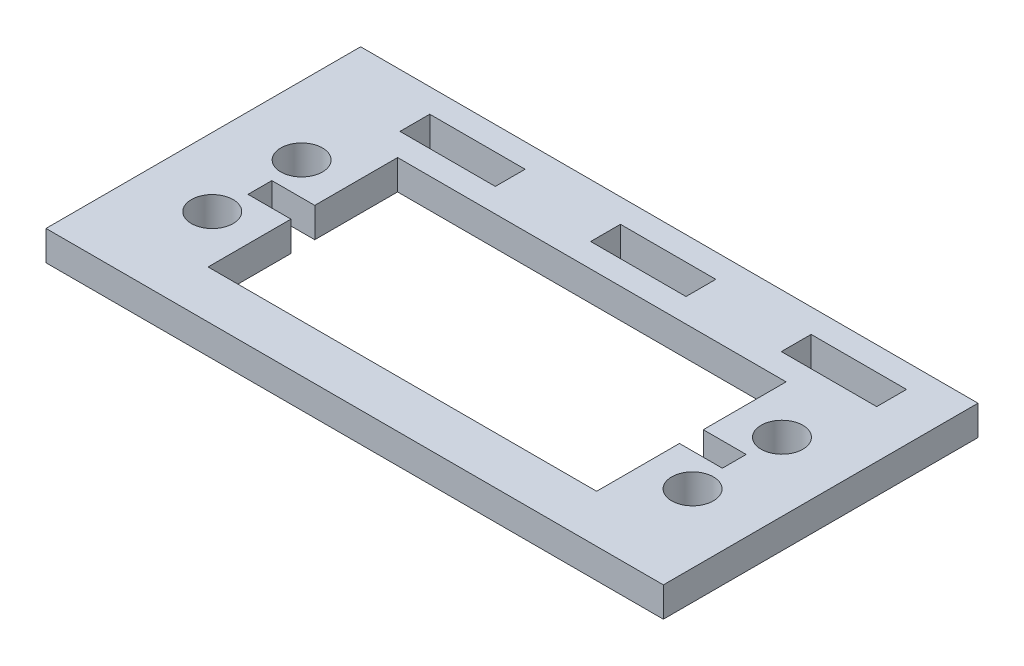
ISO-10303-21;
HEADER;
FILE_DESCRIPTION(('STEP AP214'),'2;1');
FILE_NAME('part.step','',(''),(''),'','','');
FILE_SCHEMA(('AUTOMOTIVE_DESIGN { 1 0 10303 214 1 1 1 1 }'));
ENDSEC;
DATA;
#1=APPLICATION_CONTEXT('core data for automotive mechanical design processes');
#2=APPLICATION_PROTOCOL_DEFINITION('international standard','automotive_design',2000,#1);
#3=PRODUCT_CONTEXT('',#1,'mechanical');
#4=PRODUCT('Part','Part','',(#3));
#5=PRODUCT_RELATED_PRODUCT_CATEGORY('part','',(#4));
#6=PRODUCT_DEFINITION_FORMATION('','',#4);
#7=PRODUCT_DEFINITION_CONTEXT('part definition',#1,'design');
#8=PRODUCT_DEFINITION('design','',#6,#7);
#9=PRODUCT_DEFINITION_SHAPE('','',#8);
#10=(LENGTH_UNIT() NAMED_UNIT(*) SI_UNIT(.MILLI.,.METRE.));
#11=(NAMED_UNIT(*) PLANE_ANGLE_UNIT() SI_UNIT($,.RADIAN.));
#12=(NAMED_UNIT(*) SI_UNIT($,.STERADIAN.) SOLID_ANGLE_UNIT());
#13=UNCERTAINTY_MEASURE_WITH_UNIT(LENGTH_MEASURE(1.E-05),#10,'distance_accuracy_value','');
#14=(GEOMETRIC_REPRESENTATION_CONTEXT(3) GLOBAL_UNCERTAINTY_ASSIGNED_CONTEXT((#13)) GLOBAL_UNIT_ASSIGNED_CONTEXT((#10,
#11,#12)) REPRESENTATION_CONTEXT('',''));
#15=CARTESIAN_POINT('',(0.,0.,0.));
#16=DIRECTION('',(0.,0.,1.));
#17=DIRECTION('',(1.,0.,0.));
#18=AXIS2_PLACEMENT_3D('',#15,#16,#17);
#19=CARTESIAN_POINT('',(0.,3.175,-18.3515));
#20=DIRECTION('',(0.,0.,1.));
#21=DIRECTION('',(1.,0.,0.));
#22=AXIS2_PLACEMENT_3D('',#19,#20,#21);
#23=PLANE('',#22);
#24=DIRECTION('',(-1.,0.,0.));
#25=VECTOR('',#24,1.);
#26=CARTESIAN_POINT('',(0.,0.,-18.3515));
#27=LINE('',#26,#25);
#28=CARTESIAN_POINT('',(32.893,0.,-18.3515));
#29=VERTEX_POINT('',#28);
#30=CARTESIAN_POINT('',(-32.893,0.,-18.3515));
#31=VERTEX_POINT('',#30);
#32=EDGE_CURVE('E336',#29,#31,#27,.T.);
#33=ORIENTED_EDGE('',*,*,#32,.T.);
#34=DIRECTION('',(0.,-1.,0.));
#35=VECTOR('',#34,1.);
#36=CARTESIAN_POINT('',(-32.893,3.175,-18.3515));
#37=LINE('',#36,#35);
#38=CARTESIAN_POINT('',(-32.893,3.175,-18.3515));
#39=VERTEX_POINT('',#38);
#40=EDGE_CURVE('E11',#39,#31,#37,.T.);
#41=ORIENTED_EDGE('',*,*,#40,.F.);
#42=DIRECTION('',(-1.,0.,0.));
#43=VECTOR('',#42,1.);
#44=CARTESIAN_POINT('',(0.,3.175,-18.3515));
#45=LINE('',#44,#43);
#46=CARTESIAN_POINT('',(32.893,3.175,-18.3515));
#47=VERTEX_POINT('',#46);
#48=EDGE_CURVE('E235',#47,#39,#45,.T.);
#49=ORIENTED_EDGE('',*,*,#48,.F.);
#50=DIRECTION('',(0.,-1.,0.));
#51=VECTOR('',#50,1.);
#52=CARTESIAN_POINT('',(32.893,3.175,-18.3515));
#53=LINE('',#52,#51);
#54=EDGE_CURVE('E55',#47,#29,#53,.T.);
#55=ORIENTED_EDGE('',*,*,#54,.T.);
#56=EDGE_LOOP('',(#33,#41,#49,#55));
#57=FACE_BOUND('',#56,.T.);
#58=ADVANCED_FACE('F36',(#57),#23,.F.);
#59=CARTESIAN_POINT('',(-32.893,3.175,0.));
#60=DIRECTION('',(1.,0.,0.));
#61=DIRECTION('',(0.,0.,-1.));
#62=AXIS2_PLACEMENT_3D('',#59,#60,#61);
#63=PLANE('',#62);
#64=DIRECTION('',(0.,0.,1.));
#65=VECTOR('',#64,1.);
#66=CARTESIAN_POINT('',(-32.893,0.,0.));
#67=LINE('',#66,#65);
#68=CARTESIAN_POINT('',(-32.893,0.,15.1765));
#69=VERTEX_POINT('',#68);
#70=EDGE_CURVE('E241',#31,#69,#67,.T.);
#71=ORIENTED_EDGE('',*,*,#70,.T.);
#72=DIRECTION('',(0.,-1.,0.));
#73=VECTOR('',#72,1.);
#74=CARTESIAN_POINT('',(-32.893,3.175,15.1765));
#75=LINE('',#74,#73);
#76=CARTESIAN_POINT('',(-32.893,3.175,15.1765));
#77=VERTEX_POINT('',#76);
#78=EDGE_CURVE('E46',#77,#69,#75,.T.);
#79=ORIENTED_EDGE('',*,*,#78,.F.);
#80=DIRECTION('',(0.,0.,1.));
#81=VECTOR('',#80,1.);
#82=CARTESIAN_POINT('',(-32.893,3.175,0.));
#83=LINE('',#82,#81);
#84=EDGE_CURVE('E229',#39,#77,#83,.T.);
#85=ORIENTED_EDGE('',*,*,#84,.F.);
#86=ORIENTED_EDGE('',*,*,#40,.T.);
#87=EDGE_LOOP('',(#71,#79,#85,#86));
#88=FACE_BOUND('',#87,.T.);
#89=ADVANCED_FACE('F240',(#88),#63,.F.);
#90=CARTESIAN_POINT('',(0.,3.175,15.1765));
#91=DIRECTION('',(0.,0.,1.));
#92=DIRECTION('',(1.,0.,0.));
#93=AXIS2_PLACEMENT_3D('',#90,#91,#92);
#94=PLANE('',#93);
#95=DIRECTION('',(-1.,0.,0.));
#96=VECTOR('',#95,1.);
#97=CARTESIAN_POINT('',(0.,0.,15.1765));
#98=LINE('',#97,#96);
#99=CARTESIAN_POINT('',(32.893,0.,15.1765));
#100=VERTEX_POINT('',#99);
#101=EDGE_CURVE('E339',#100,#69,#98,.T.);
#102=ORIENTED_EDGE('',*,*,#101,.F.);
#103=DIRECTION('',(0.,-1.,0.));
#104=VECTOR('',#103,1.);
#105=CARTESIAN_POINT('',(32.893,3.175,15.1765));
#106=LINE('',#105,#104);
#107=CARTESIAN_POINT('',(32.893,3.175,15.1765));
#108=VERTEX_POINT('',#107);
#109=EDGE_CURVE('E141',#108,#100,#106,.T.);
#110=ORIENTED_EDGE('',*,*,#109,.F.);
#111=DIRECTION('',(-1.,0.,0.));
#112=VECTOR('',#111,1.);
#113=CARTESIAN_POINT('',(0.,3.175,15.1765));
#114=LINE('',#113,#112);
#115=EDGE_CURVE('E234',#108,#77,#114,.T.);
#116=ORIENTED_EDGE('',*,*,#115,.T.);
#117=ORIENTED_EDGE('',*,*,#78,.T.);
#118=EDGE_LOOP('',(#102,#110,#116,#117));
#119=FACE_BOUND('',#118,.T.);
#120=ADVANCED_FACE('F245',(#119),#94,.T.);
#121=CARTESIAN_POINT('',(17.653,3.175,0.));
#122=DIRECTION('',(1.,0.,0.));
#123=DIRECTION('',(0.,0.,-1.));
#124=AXIS2_PLACEMENT_3D('',#121,#122,#123);
#125=PLANE('',#124);
#126=DIRECTION('',(0.,0.,1.));
#127=VECTOR('',#126,1.);
#128=CARTESIAN_POINT('',(17.653,0.,0.));
#129=LINE('',#128,#127);
#130=CARTESIAN_POINT('',(17.653,0.,-15.8115));
#131=VERTEX_POINT('',#130);
#132=CARTESIAN_POINT('',(17.653,0.,-12.6365));
#133=VERTEX_POINT('',#132);
#134=EDGE_CURVE('E324',#131,#133,#129,.T.);
#135=ORIENTED_EDGE('',*,*,#134,.F.);
#136=DIRECTION('',(0.,-1.,0.));
#137=VECTOR('',#136,1.);
#138=CARTESIAN_POINT('',(17.653,3.175,-15.8115));
#139=LINE('',#138,#137);
#140=CARTESIAN_POINT('',(17.653,3.175,-15.8115));
#141=VERTEX_POINT('',#140);
#142=EDGE_CURVE('E346',#141,#131,#139,.T.);
#143=ORIENTED_EDGE('',*,*,#142,.F.);
#144=DIRECTION('',(0.,0.,1.));
#145=VECTOR('',#144,1.);
#146=CARTESIAN_POINT('',(17.653,3.175,0.));
#147=LINE('',#146,#145);
#148=CARTESIAN_POINT('',(17.653,3.175,-12.6365));
#149=VERTEX_POINT('',#148);
#150=EDGE_CURVE('E807',#141,#149,#147,.T.);
#151=ORIENTED_EDGE('',*,*,#150,.T.);
#152=DIRECTION('',(0.,-1.,0.));
#153=VECTOR('',#152,1.);
#154=CARTESIAN_POINT('',(17.653,3.175,-12.6365));
#155=LINE('',#154,#153);
#156=EDGE_CURVE('E348',#149,#133,#155,.T.);
#157=ORIENTED_EDGE('',*,*,#156,.T.);
#158=EDGE_LOOP('',(#135,#143,#151,#157));
#159=FACE_BOUND('',#158,.T.);
#160=ADVANCED_FACE('F490',(#159),#125,.T.);
#161=CARTESIAN_POINT('',(0.,3.175,-15.8115));
#162=DIRECTION('',(0.,0.,1.));
#163=DIRECTION('',(1.,0.,0.));
#164=AXIS2_PLACEMENT_3D('',#161,#162,#163);
#165=PLANE('',#164);
#166=DIRECTION('',(-1.,0.,0.));
#167=VECTOR('',#166,1.);
#168=CARTESIAN_POINT('',(0.,0.,-15.8115));
#169=LINE('',#168,#167);
#170=CARTESIAN_POINT('',(27.813,0.,-15.8115));
#171=VERTEX_POINT('',#170);
#172=EDGE_CURVE('E327',#171,#131,#169,.T.);
#173=ORIENTED_EDGE('',*,*,#172,.F.);
#174=DIRECTION('',(0.,-1.,0.));
#175=VECTOR('',#174,1.);
#176=CARTESIAN_POINT('',(27.813,3.175,-15.8115));
#177=LINE('',#176,#175);
#178=CARTESIAN_POINT('',(27.813,3.175,-15.8115));
#179=VERTEX_POINT('',#178);
#180=EDGE_CURVE('E354',#179,#171,#177,.T.);
#181=ORIENTED_EDGE('',*,*,#180,.F.);
#182=DIRECTION('',(-1.,0.,0.));
#183=VECTOR('',#182,1.);
#184=CARTESIAN_POINT('',(0.,3.175,-15.8115));
#185=LINE('',#184,#183);
#186=EDGE_CURVE('E810',#179,#141,#185,.T.);
#187=ORIENTED_EDGE('',*,*,#186,.T.);
#188=ORIENTED_EDGE('',*,*,#142,.T.);
#189=EDGE_LOOP('',(#173,#181,#187,#188));
#190=FACE_BOUND('',#189,.T.);
#191=ADVANCED_FACE('F486',(#190),#165,.T.);
#192=CARTESIAN_POINT('',(27.813,3.175,0.));
#193=DIRECTION('',(1.,0.,0.));
#194=DIRECTION('',(0.,0.,-1.));
#195=AXIS2_PLACEMENT_3D('',#192,#193,#194);
#196=PLANE('',#195);
#197=DIRECTION('',(0.,0.,1.));
#198=VECTOR('',#197,1.);
#199=CARTESIAN_POINT('',(27.813,0.,0.));
#200=LINE('',#199,#198);
#201=CARTESIAN_POINT('',(27.813,0.,-12.6365));
#202=VERTEX_POINT('',#201);
#203=EDGE_CURVE('E330',#171,#202,#200,.T.);
#204=ORIENTED_EDGE('',*,*,#203,.T.);
#205=DIRECTION('',(0.,-1.,0.));
#206=VECTOR('',#205,1.);
#207=CARTESIAN_POINT('',(27.813,3.175,-12.6365));
#208=LINE('',#207,#206);
#209=CARTESIAN_POINT('',(27.813,3.175,-12.6365));
#210=VERTEX_POINT('',#209);
#211=EDGE_CURVE('E350',#210,#202,#208,.T.);
#212=ORIENTED_EDGE('',*,*,#211,.F.);
#213=DIRECTION('',(0.,0.,1.));
#214=VECTOR('',#213,1.);
#215=CARTESIAN_POINT('',(27.813,3.175,0.));
#216=LINE('',#215,#214);
#217=EDGE_CURVE('E818',#179,#210,#216,.T.);
#218=ORIENTED_EDGE('',*,*,#217,.F.);
#219=ORIENTED_EDGE('',*,*,#180,.T.);
#220=EDGE_LOOP('',(#204,#212,#218,#219));
#221=FACE_BOUND('',#220,.T.);
#222=ADVANCED_FACE('F482',(#221),#196,.F.);
#223=CARTESIAN_POINT('',(-2.66700000000001,3.175,0.));
#224=DIRECTION('',(1.,0.,0.));
#225=DIRECTION('',(0.,0.,-1.));
#226=AXIS2_PLACEMENT_3D('',#223,#224,#225);
#227=PLANE('',#226);
#228=DIRECTION('',(0.,0.,1.));
#229=VECTOR('',#228,1.);
#230=CARTESIAN_POINT('',(-2.66700000000001,0.,0.));
#231=LINE('',#230,#229);
#232=CARTESIAN_POINT('',(-2.66700000000001,0.,-15.8114999999999));
#233=VERTEX_POINT('',#232);
#234=CARTESIAN_POINT('',(-2.66700000000001,0.,-12.6364999999999));
#235=VERTEX_POINT('',#234);
#236=EDGE_CURVE('E312',#233,#235,#231,.T.);
#237=ORIENTED_EDGE('',*,*,#236,.F.);
#238=DIRECTION('',(0.,-1.,0.));
#239=VECTOR('',#238,1.);
#240=CARTESIAN_POINT('',(-2.66700000000001,3.175,-15.8114999999999));
#241=LINE('',#240,#239);
#242=CARTESIAN_POINT('',(-2.66700000000001,3.175,-15.8114999999999));
#243=VERTEX_POINT('',#242);
#244=EDGE_CURVE('E351',#243,#233,#241,.T.);
#245=ORIENTED_EDGE('',*,*,#244,.F.);
#246=DIRECTION('',(0.,0.,1.));
#247=VECTOR('',#246,1.);
#248=CARTESIAN_POINT('',(-2.66700000000001,3.175,0.));
#249=LINE('',#248,#247);
#250=CARTESIAN_POINT('',(-2.66700000000001,3.175,-12.6364999999999));
#251=VERTEX_POINT('',#250);
#252=EDGE_CURVE('E802',#243,#251,#249,.T.);
#253=ORIENTED_EDGE('',*,*,#252,.T.);
#254=DIRECTION('',(0.,-1.,0.));
#255=VECTOR('',#254,1.);
#256=CARTESIAN_POINT('',(-2.66700000000001,3.175,-12.6364999999999));
#257=LINE('',#256,#255);
#258=EDGE_CURVE('E357',#251,#235,#257,.T.);
#259=ORIENTED_EDGE('',*,*,#258,.T.);
#260=EDGE_LOOP('',(#237,#245,#253,#259));
#261=FACE_BOUND('',#260,.T.);
#262=ADVANCED_FACE('F485',(#261),#227,.T.);
#263=CARTESIAN_POINT('',(0.,3.175,-15.8114999999999));
#264=DIRECTION('',(0.,0.,1.));
#265=DIRECTION('',(1.,0.,0.));
#266=AXIS2_PLACEMENT_3D('',#263,#264,#265);
#267=PLANE('',#266);
#268=DIRECTION('',(-1.,0.,0.));
#269=VECTOR('',#268,1.);
#270=CARTESIAN_POINT('',(0.,0.,-15.8114999999999));
#271=LINE('',#270,#269);
#272=CARTESIAN_POINT('',(7.493,0.,-15.8114999999999));
#273=VERTEX_POINT('',#272);
#274=EDGE_CURVE('E315',#273,#233,#271,.T.);
#275=ORIENTED_EDGE('',*,*,#274,.F.);
#276=DIRECTION('',(0.,-1.,0.));
#277=VECTOR('',#276,1.);
#278=CARTESIAN_POINT('',(7.493,3.175,-15.8114999999999));
#279=LINE('',#278,#277);
#280=CARTESIAN_POINT('',(7.493,3.175,-15.8114999999999));
#281=VERTEX_POINT('',#280);
#282=EDGE_CURVE('E363',#281,#273,#279,.T.);
#283=ORIENTED_EDGE('',*,*,#282,.F.);
#284=DIRECTION('',(-1.,0.,0.));
#285=VECTOR('',#284,1.);
#286=CARTESIAN_POINT('',(0.,3.175,-15.8114999999999));
#287=LINE('',#286,#285);
#288=EDGE_CURVE('E827',#281,#243,#287,.T.);
#289=ORIENTED_EDGE('',*,*,#288,.T.);
#290=ORIENTED_EDGE('',*,*,#244,.T.);
#291=EDGE_LOOP('',(#275,#283,#289,#290));
#292=FACE_BOUND('',#291,.T.);
#293=ADVANCED_FACE('F503',(#292),#267,.T.);
#294=CARTESIAN_POINT('',(7.493,3.175,0.));
#295=DIRECTION('',(1.,0.,0.));
#296=DIRECTION('',(0.,0.,-1.));
#297=AXIS2_PLACEMENT_3D('',#294,#295,#296);
#298=PLANE('',#297);
#299=DIRECTION('',(0.,0.,1.));
#300=VECTOR('',#299,1.);
#301=CARTESIAN_POINT('',(7.493,0.,0.));
#302=LINE('',#301,#300);
#303=CARTESIAN_POINT('',(7.493,0.,-12.6364999999999));
#304=VERTEX_POINT('',#303);
#305=EDGE_CURVE('E318',#273,#304,#302,.T.);
#306=ORIENTED_EDGE('',*,*,#305,.T.);
#307=DIRECTION('',(0.,-1.,0.));
#308=VECTOR('',#307,1.);
#309=CARTESIAN_POINT('',(7.493,3.175,-12.6364999999999));
#310=LINE('',#309,#308);
#311=CARTESIAN_POINT('',(7.493,3.175,-12.6364999999999));
#312=VERTEX_POINT('',#311);
#313=EDGE_CURVE('E359',#312,#304,#310,.T.);
#314=ORIENTED_EDGE('',*,*,#313,.F.);
#315=DIRECTION('',(0.,0.,1.));
#316=VECTOR('',#315,1.);
#317=CARTESIAN_POINT('',(7.493,3.175,0.));
#318=LINE('',#317,#316);
#319=EDGE_CURVE('E824',#281,#312,#318,.T.);
#320=ORIENTED_EDGE('',*,*,#319,.F.);
#321=ORIENTED_EDGE('',*,*,#282,.T.);
#322=EDGE_LOOP('',(#306,#314,#320,#321));
#323=FACE_BOUND('',#322,.T.);
#324=ADVANCED_FACE('F499',(#323),#298,.F.);
#325=CARTESIAN_POINT('',(-22.987,3.175,0.));
#326=DIRECTION('',(1.,0.,0.));
#327=DIRECTION('',(0.,0.,-1.));
#328=AXIS2_PLACEMENT_3D('',#325,#326,#327);
#329=PLANE('',#328);
#330=DIRECTION('',(0.,0.,1.));
#331=VECTOR('',#330,1.);
#332=CARTESIAN_POINT('',(-22.987,0.,0.));
#333=LINE('',#332,#331);
#334=CARTESIAN_POINT('',(-22.987,0.,-15.8114999999997));
#335=VERTEX_POINT('',#334);
#336=CARTESIAN_POINT('',(-22.987,0.,-12.6364999999997));
#337=VERTEX_POINT('',#336);
#338=EDGE_CURVE('E300',#335,#337,#333,.T.);
#339=ORIENTED_EDGE('',*,*,#338,.F.);
#340=DIRECTION('',(0.,-1.,0.));
#341=VECTOR('',#340,1.);
#342=CARTESIAN_POINT('',(-22.987,3.175,-15.8114999999997));
#343=LINE('',#342,#341);
#344=CARTESIAN_POINT('',(-22.987,3.175,-15.8114999999997));
#345=VERTEX_POINT('',#344);
#346=EDGE_CURVE('E360',#345,#335,#343,.T.);
#347=ORIENTED_EDGE('',*,*,#346,.F.);
#348=DIRECTION('',(0.,0.,1.));
#349=VECTOR('',#348,1.);
#350=CARTESIAN_POINT('',(-22.987,3.175,0.));
#351=LINE('',#350,#349);
#352=CARTESIAN_POINT('',(-22.987,3.175,-12.6364999999997));
#353=VERTEX_POINT('',#352);
#354=EDGE_CURVE('E796',#345,#353,#351,.T.);
#355=ORIENTED_EDGE('',*,*,#354,.T.);
#356=DIRECTION('',(0.,-1.,0.));
#357=VECTOR('',#356,1.);
#358=CARTESIAN_POINT('',(-22.987,3.175,-12.6364999999997));
#359=LINE('',#358,#357);
#360=EDGE_CURVE('E366',#353,#337,#359,.T.);
#361=ORIENTED_EDGE('',*,*,#360,.T.);
#362=EDGE_LOOP('',(#339,#347,#355,#361));
#363=FACE_BOUND('',#362,.T.);
#364=ADVANCED_FACE('F502',(#363),#329,.T.);
#365=CARTESIAN_POINT('',(0.,3.175,-15.8114999999997));
#366=DIRECTION('',(0.,0.,1.));
#367=DIRECTION('',(1.,0.,0.));
#368=AXIS2_PLACEMENT_3D('',#365,#366,#367);
#369=PLANE('',#368);
#370=DIRECTION('',(-1.,0.,0.));
#371=VECTOR('',#370,1.);
#372=CARTESIAN_POINT('',(0.,0.,-15.8114999999997));
#373=LINE('',#372,#371);
#374=CARTESIAN_POINT('',(-12.827,0.,-15.8114999999997));
#375=VERTEX_POINT('',#374);
#376=EDGE_CURVE('E303',#375,#335,#373,.T.);
#377=ORIENTED_EDGE('',*,*,#376,.F.);
#378=DIRECTION('',(0.,-1.,0.));
#379=VECTOR('',#378,1.);
#380=CARTESIAN_POINT('',(-12.827,3.175,-15.8114999999997));
#381=LINE('',#380,#379);
#382=CARTESIAN_POINT('',(-12.827,3.175,-15.8114999999997));
#383=VERTEX_POINT('',#382);
#384=EDGE_CURVE('E371',#383,#375,#381,.T.);
#385=ORIENTED_EDGE('',*,*,#384,.F.);
#386=DIRECTION('',(-1.,0.,0.));
#387=VECTOR('',#386,1.);
#388=CARTESIAN_POINT('',(0.,3.175,-15.8114999999997));
#389=LINE('',#388,#387);
#390=EDGE_CURVE('E835',#383,#345,#389,.T.);
#391=ORIENTED_EDGE('',*,*,#390,.T.);
#392=ORIENTED_EDGE('',*,*,#346,.T.);
#393=EDGE_LOOP('',(#377,#385,#391,#392));
#394=FACE_BOUND('',#393,.T.);
#395=ADVANCED_FACE('F517',(#394),#369,.T.);
#396=CARTESIAN_POINT('',(-12.827,3.175,0.));
#397=DIRECTION('',(1.,0.,0.));
#398=DIRECTION('',(0.,0.,-1.));
#399=AXIS2_PLACEMENT_3D('',#396,#397,#398);
#400=PLANE('',#399);
#401=DIRECTION('',(0.,0.,1.));
#402=VECTOR('',#401,1.);
#403=CARTESIAN_POINT('',(-12.827,0.,0.));
#404=LINE('',#403,#402);
#405=CARTESIAN_POINT('',(-12.827,0.,-12.6364999999997));
#406=VERTEX_POINT('',#405);
#407=EDGE_CURVE('E306',#375,#406,#404,.T.);
#408=ORIENTED_EDGE('',*,*,#407,.T.);
#409=DIRECTION('',(0.,-1.,0.));
#410=VECTOR('',#409,1.);
#411=CARTESIAN_POINT('',(-12.827,3.175,-12.6364999999997));
#412=LINE('',#411,#410);
#413=CARTESIAN_POINT('',(-12.827,3.175,-12.6364999999997));
#414=VERTEX_POINT('',#413);
#415=EDGE_CURVE('E368',#414,#406,#412,.T.);
#416=ORIENTED_EDGE('',*,*,#415,.F.);
#417=DIRECTION('',(0.,0.,1.));
#418=VECTOR('',#417,1.);
#419=CARTESIAN_POINT('',(-12.827,3.175,0.));
#420=LINE('',#419,#418);
#421=EDGE_CURVE('E832',#383,#414,#420,.T.);
#422=ORIENTED_EDGE('',*,*,#421,.F.);
#423=ORIENTED_EDGE('',*,*,#384,.T.);
#424=EDGE_LOOP('',(#408,#416,#422,#423));
#425=FACE_BOUND('',#424,.T.);
#426=ADVANCED_FACE('F514',(#425),#400,.F.);
#427=CARTESIAN_POINT('',(20.701,3.175,0.));
#428=DIRECTION('',(-1.,0.,0.));
#429=DIRECTION('',(0.,0.,1.));
#430=AXIS2_PLACEMENT_3D('',#427,#428,#429);
#431=PLANE('',#430);
#432=DIRECTION('',(0.,0.,-1.));
#433=VECTOR('',#432,1.);
#434=CARTESIAN_POINT('',(20.701,0.,0.));
#435=LINE('',#434,#433);
#436=CARTESIAN_POINT('',(20.701,0.,-1.27000000000001));
#437=VERTEX_POINT('',#436);
#438=CARTESIAN_POINT('',(20.701,0.,-10.0965));
#439=VERTEX_POINT('',#438);
#440=EDGE_CURVE('E264',#437,#439,#435,.T.);
#441=ORIENTED_EDGE('',*,*,#440,.F.);
#442=DIRECTION('',(0.,-1.,0.));
#443=VECTOR('',#442,1.);
#444=CARTESIAN_POINT('',(20.701,3.175,-1.27000000000001));
#445=LINE('',#444,#443);
#446=CARTESIAN_POINT('',(20.701,3.175,-1.27000000000001));
#447=VERTEX_POINT('',#446);
#448=EDGE_CURVE('E40',#447,#437,#445,.T.);
#449=ORIENTED_EDGE('',*,*,#448,.F.);
#450=DIRECTION('',(0.,0.,-1.));
#451=VECTOR('',#450,1.);
#452=CARTESIAN_POINT('',(20.701,3.175,0.));
#453=LINE('',#452,#451);
#454=CARTESIAN_POINT('',(20.701,3.175,-10.0965));
#455=VERTEX_POINT('',#454);
#456=EDGE_CURVE('E408',#447,#455,#453,.T.);
#457=ORIENTED_EDGE('',*,*,#456,.T.);
#458=DIRECTION('',(0.,-1.,0.));
#459=VECTOR('',#458,1.);
#460=CARTESIAN_POINT('',(20.701,3.175,-10.0965));
#461=LINE('',#460,#459);
#462=EDGE_CURVE('E248',#455,#439,#461,.T.);
#463=ORIENTED_EDGE('',*,*,#462,.T.);
#464=EDGE_LOOP('',(#441,#449,#457,#463));
#465=FACE_BOUND('',#464,.T.);
#466=ADVANCED_FACE('F406',(#465),#431,.T.);
#467=CARTESIAN_POINT('',(0.,3.175,-1.27000000000001));
#468=DIRECTION('',(0.,0.,-1.));
#469=DIRECTION('',(-1.,0.,0.));
#470=AXIS2_PLACEMENT_3D('',#467,#468,#469);
#471=PLANE('',#470);
#472=DIRECTION('',(1.,0.,0.));
#473=VECTOR('',#472,1.);
#474=CARTESIAN_POINT('',(0.,0.,-1.27000000000001));
#475=LINE('',#474,#473);
#476=CARTESIAN_POINT('',(25.273,0.,-1.27000000000001));
#477=VERTEX_POINT('',#476);
#478=EDGE_CURVE('E267',#437,#477,#475,.T.);
#479=ORIENTED_EDGE('',*,*,#478,.T.);
#480=DIRECTION('',(0.,-1.,0.));
#481=VECTOR('',#480,1.);
#482=CARTESIAN_POINT('',(25.273,3.175,-1.27000000000001));
#483=LINE('',#482,#481);
#484=CARTESIAN_POINT('',(25.273,3.175,-1.27000000000001));
#485=VERTEX_POINT('',#484);
#486=EDGE_CURVE('E392',#485,#477,#483,.T.);
#487=ORIENTED_EDGE('',*,*,#486,.F.);
#488=DIRECTION('',(1.,0.,0.));
#489=VECTOR('',#488,1.);
#490=CARTESIAN_POINT('',(0.,3.175,-1.27000000000001));
#491=LINE('',#490,#489);
#492=EDGE_CURVE('E400',#447,#485,#491,.T.);
#493=ORIENTED_EDGE('',*,*,#492,.F.);
#494=ORIENTED_EDGE('',*,*,#448,.T.);
#495=EDGE_LOOP('',(#479,#487,#493,#494));
#496=FACE_BOUND('',#495,.T.);
#497=ADVANCED_FACE('F398',(#496),#471,.F.);
#498=CARTESIAN_POINT('',(25.273,3.175,0.));
#499=DIRECTION('',(1.,0.,0.));
#500=DIRECTION('',(0.,0.,-1.));
#501=AXIS2_PLACEMENT_3D('',#498,#499,#500);
#502=PLANE('',#501);
#503=DIRECTION('',(0.,0.,1.));
#504=VECTOR('',#503,1.);
#505=CARTESIAN_POINT('',(25.273,0.,0.));
#506=LINE('',#505,#504);
#507=CARTESIAN_POINT('',(25.273,0.,1.26999999999999));
#508=VERTEX_POINT('',#507);
#509=EDGE_CURVE('E270',#477,#508,#506,.T.);
#510=ORIENTED_EDGE('',*,*,#509,.T.);
#511=DIRECTION('',(0.,-1.,0.));
#512=VECTOR('',#511,1.);
#513=CARTESIAN_POINT('',(25.273,3.175,1.26999999999999));
#514=LINE('',#513,#512);
#515=CARTESIAN_POINT('',(25.273,3.175,1.26999999999999));
#516=VERTEX_POINT('',#515);
#517=EDGE_CURVE('E391',#516,#508,#514,.T.);
#518=ORIENTED_EDGE('',*,*,#517,.F.);
#519=DIRECTION('',(0.,0.,1.));
#520=VECTOR('',#519,1.);
#521=CARTESIAN_POINT('',(25.273,3.175,0.));
#522=LINE('',#521,#520);
#523=EDGE_CURVE('E849',#485,#516,#522,.T.);
#524=ORIENTED_EDGE('',*,*,#523,.F.);
#525=ORIENTED_EDGE('',*,*,#486,.T.);
#526=EDGE_LOOP('',(#510,#518,#524,#525));
#527=FACE_BOUND('',#526,.T.);
#528=ADVANCED_FACE('F460',(#527),#502,.F.);
#529=CARTESIAN_POINT('',(0.,3.175,1.26999999999999));
#530=DIRECTION('',(0.,0.,-1.));
#531=DIRECTION('',(-1.,0.,0.));
#532=AXIS2_PLACEMENT_3D('',#529,#530,#531);
#533=PLANE('',#532);
#534=DIRECTION('',(1.,0.,0.));
#535=VECTOR('',#534,1.);
#536=CARTESIAN_POINT('',(0.,0.,1.26999999999999));
#537=LINE('',#536,#535);
#538=CARTESIAN_POINT('',(20.701,0.,1.26999999999999));
#539=VERTEX_POINT('',#538);
#540=EDGE_CURVE('E273',#539,#508,#537,.T.);
#541=ORIENTED_EDGE('',*,*,#540,.F.);
#542=DIRECTION('',(0.,-1.,0.));
#543=VECTOR('',#542,1.);
#544=CARTESIAN_POINT('',(20.701,3.175,1.26999999999999));
#545=LINE('',#544,#543);
#546=CARTESIAN_POINT('',(20.701,3.175,1.26999999999999));
#547=VERTEX_POINT('',#546);
#548=EDGE_CURVE('E389',#547,#539,#545,.T.);
#549=ORIENTED_EDGE('',*,*,#548,.F.);
#550=DIRECTION('',(1.,0.,0.));
#551=VECTOR('',#550,1.);
#552=CARTESIAN_POINT('',(0.,3.175,1.26999999999999));
#553=LINE('',#552,#551);
#554=EDGE_CURVE('E459',#547,#516,#553,.T.);
#555=ORIENTED_EDGE('',*,*,#554,.T.);
#556=ORIENTED_EDGE('',*,*,#517,.T.);
#557=EDGE_LOOP('',(#541,#549,#555,#556));
#558=FACE_BOUND('',#557,.T.);
#559=ADVANCED_FACE('F457',(#558),#533,.T.);
#560=CARTESIAN_POINT('',(20.701,3.175,0.));
#561=DIRECTION('',(-1.,0.,0.));
#562=DIRECTION('',(0.,0.,1.));
#563=AXIS2_PLACEMENT_3D('',#560,#561,#562);
#564=PLANE('',#563);
#565=DIRECTION('',(0.,0.,-1.));
#566=VECTOR('',#565,1.);
#567=CARTESIAN_POINT('',(20.701,0.,0.));
#568=LINE('',#567,#566);
#569=CARTESIAN_POINT('',(20.701,0.,10.0965));
#570=VERTEX_POINT('',#569);
#571=EDGE_CURVE('E276',#570,#539,#568,.T.);
#572=ORIENTED_EDGE('',*,*,#571,.F.);
#573=DIRECTION('',(0.,-1.,0.));
#574=VECTOR('',#573,1.);
#575=CARTESIAN_POINT('',(20.701,3.175,10.0965));
#576=LINE('',#575,#574);
#577=CARTESIAN_POINT('',(20.701,3.175,10.0965));
#578=VERTEX_POINT('',#577);
#579=EDGE_CURVE('E387',#578,#570,#576,.T.);
#580=ORIENTED_EDGE('',*,*,#579,.F.);
#581=DIRECTION('',(0.,0.,-1.));
#582=VECTOR('',#581,1.);
#583=CARTESIAN_POINT('',(20.701,3.175,0.));
#584=LINE('',#583,#582);
#585=EDGE_CURVE('E453',#578,#547,#584,.T.);
#586=ORIENTED_EDGE('',*,*,#585,.T.);
#587=ORIENTED_EDGE('',*,*,#548,.T.);
#588=EDGE_LOOP('',(#572,#580,#586,#587));
#589=FACE_BOUND('',#588,.T.);
#590=ADVANCED_FACE('F451',(#589),#564,.T.);
#591=CARTESIAN_POINT('',(0.,3.175,10.0965));
#592=DIRECTION('',(0.,0.,-1.));
#593=DIRECTION('',(-1.,0.,0.));
#594=AXIS2_PLACEMENT_3D('',#591,#592,#593);
#595=PLANE('',#594);
#596=DIRECTION('',(1.,0.,0.));
#597=VECTOR('',#596,1.);
#598=CARTESIAN_POINT('',(0.,0.,10.0965));
#599=LINE('',#598,#597);
#600=CARTESIAN_POINT('',(-20.701,0.,10.0965));
#601=VERTEX_POINT('',#600);
#602=EDGE_CURVE('E279',#601,#570,#599,.T.);
#603=ORIENTED_EDGE('',*,*,#602,.F.);
#604=DIRECTION('',(0.,-1.,0.));
#605=VECTOR('',#604,1.);
#606=CARTESIAN_POINT('',(-20.701,3.175,10.0965));
#607=LINE('',#606,#605);
#608=CARTESIAN_POINT('',(-20.701,3.175,10.0965));
#609=VERTEX_POINT('',#608);
#610=EDGE_CURVE('E385',#609,#601,#607,.T.);
#611=ORIENTED_EDGE('',*,*,#610,.F.);
#612=DIRECTION('',(1.,0.,0.));
#613=VECTOR('',#612,1.);
#614=CARTESIAN_POINT('',(0.,3.175,10.0965));
#615=LINE('',#614,#613);
#616=EDGE_CURVE('E447',#609,#578,#615,.T.);
#617=ORIENTED_EDGE('',*,*,#616,.T.);
#618=ORIENTED_EDGE('',*,*,#579,.T.);
#619=EDGE_LOOP('',(#603,#611,#617,#618));
#620=FACE_BOUND('',#619,.T.);
#621=ADVANCED_FACE('F444',(#620),#595,.T.);
#622=CARTESIAN_POINT('',(-20.701,3.175,0.));
#623=DIRECTION('',(1.,0.,0.));
#624=DIRECTION('',(0.,0.,-1.));
#625=AXIS2_PLACEMENT_3D('',#622,#623,#624);
#626=PLANE('',#625);
#627=DIRECTION('',(0.,0.,1.));
#628=VECTOR('',#627,1.);
#629=CARTESIAN_POINT('',(-20.701,0.,0.));
#630=LINE('',#629,#628);
#631=CARTESIAN_POINT('',(-20.701,0.,1.26999999999999));
#632=VERTEX_POINT('',#631);
#633=EDGE_CURVE('E282',#632,#601,#630,.T.);
#634=ORIENTED_EDGE('',*,*,#633,.F.);
#635=DIRECTION('',(0.,-1.,0.));
#636=VECTOR('',#635,1.);
#637=CARTESIAN_POINT('',(-20.701,3.175,1.26999999999999));
#638=LINE('',#637,#636);
#639=CARTESIAN_POINT('',(-20.701,3.175,1.26999999999999));
#640=VERTEX_POINT('',#639);
#641=EDGE_CURVE('E383',#640,#632,#638,.T.);
#642=ORIENTED_EDGE('',*,*,#641,.F.);
#643=DIRECTION('',(0.,0.,1.));
#644=VECTOR('',#643,1.);
#645=CARTESIAN_POINT('',(-20.701,3.175,0.));
#646=LINE('',#645,#644);
#647=EDGE_CURVE('E440',#640,#609,#646,.T.);
#648=ORIENTED_EDGE('',*,*,#647,.T.);
#649=ORIENTED_EDGE('',*,*,#610,.T.);
#650=EDGE_LOOP('',(#634,#642,#648,#649));
#651=FACE_BOUND('',#650,.T.);
#652=ADVANCED_FACE('F439',(#651),#626,.T.);
#653=CARTESIAN_POINT('',(0.,3.175,1.26999999999999));
#654=DIRECTION('',(0.,0.,1.));
#655=DIRECTION('',(1.,0.,0.));
#656=AXIS2_PLACEMENT_3D('',#653,#654,#655);
#657=PLANE('',#656);
#658=DIRECTION('',(-1.,0.,0.));
#659=VECTOR('',#658,1.);
#660=CARTESIAN_POINT('',(0.,0.,1.26999999999999));
#661=LINE('',#660,#659);
#662=CARTESIAN_POINT('',(-25.273,0.,1.26999999999999));
#663=VERTEX_POINT('',#662);
#664=EDGE_CURVE('E285',#632,#663,#661,.T.);
#665=ORIENTED_EDGE('',*,*,#664,.T.);
#666=DIRECTION('',(0.,-1.,0.));
#667=VECTOR('',#666,1.);
#668=CARTESIAN_POINT('',(-25.273,3.175,1.26999999999999));
#669=LINE('',#668,#667);
#670=CARTESIAN_POINT('',(-25.273,3.175,1.26999999999999));
#671=VERTEX_POINT('',#670);
#672=EDGE_CURVE('E381',#671,#663,#669,.T.);
#673=ORIENTED_EDGE('',*,*,#672,.F.);
#674=DIRECTION('',(-1.,0.,0.));
#675=VECTOR('',#674,1.);
#676=CARTESIAN_POINT('',(0.,3.175,1.26999999999999));
#677=LINE('',#676,#675);
#678=EDGE_CURVE('E435',#640,#671,#677,.T.);
#679=ORIENTED_EDGE('',*,*,#678,.F.);
#680=ORIENTED_EDGE('',*,*,#641,.T.);
#681=EDGE_LOOP('',(#665,#673,#679,#680));
#682=FACE_BOUND('',#681,.T.);
#683=ADVANCED_FACE('F434',(#682),#657,.F.);
#684=CARTESIAN_POINT('',(-25.273,3.175,0.));
#685=DIRECTION('',(1.,0.,0.));
#686=DIRECTION('',(0.,0.,-1.));
#687=AXIS2_PLACEMENT_3D('',#684,#685,#686);
#688=PLANE('',#687);
#689=DIRECTION('',(0.,0.,1.));
#690=VECTOR('',#689,1.);
#691=CARTESIAN_POINT('',(-25.273,0.,0.));
#692=LINE('',#691,#690);
#693=CARTESIAN_POINT('',(-25.273,0.,-1.27000000000001));
#694=VERTEX_POINT('',#693);
#695=EDGE_CURVE('E288',#694,#663,#692,.T.);
#696=ORIENTED_EDGE('',*,*,#695,.F.);
#697=DIRECTION('',(0.,-1.,0.));
#698=VECTOR('',#697,1.);
#699=CARTESIAN_POINT('',(-25.273,3.175,-1.27000000000001));
#700=LINE('',#699,#698);
#701=CARTESIAN_POINT('',(-25.273,3.175,-1.27000000000001));
#702=VERTEX_POINT('',#701);
#703=EDGE_CURVE('E379',#702,#694,#700,.T.);
#704=ORIENTED_EDGE('',*,*,#703,.F.);
#705=DIRECTION('',(0.,0.,1.));
#706=VECTOR('',#705,1.);
#707=CARTESIAN_POINT('',(-25.273,3.175,0.));
#708=LINE('',#707,#706);
#709=EDGE_CURVE('E431',#702,#671,#708,.T.);
#710=ORIENTED_EDGE('',*,*,#709,.T.);
#711=ORIENTED_EDGE('',*,*,#672,.T.);
#712=EDGE_LOOP('',(#696,#704,#710,#711));
#713=FACE_BOUND('',#712,.T.);
#714=ADVANCED_FACE('F427',(#713),#688,.T.);
#715=CARTESIAN_POINT('',(0.,3.175,-1.27000000000001));
#716=DIRECTION('',(0.,0.,1.));
#717=DIRECTION('',(1.,0.,0.));
#718=AXIS2_PLACEMENT_3D('',#715,#716,#717);
#719=PLANE('',#718);
#720=DIRECTION('',(-1.,0.,0.));
#721=VECTOR('',#720,1.);
#722=CARTESIAN_POINT('',(0.,0.,-1.27000000000001));
#723=LINE('',#722,#721);
#724=CARTESIAN_POINT('',(-20.701,0.,-1.27000000000001));
#725=VERTEX_POINT('',#724);
#726=EDGE_CURVE('E291',#725,#694,#723,.T.);
#727=ORIENTED_EDGE('',*,*,#726,.F.);
#728=DIRECTION('',(0.,-1.,0.));
#729=VECTOR('',#728,1.);
#730=CARTESIAN_POINT('',(-20.701,3.175,-1.27000000000001));
#731=LINE('',#730,#729);
#732=CARTESIAN_POINT('',(-20.701,3.175,-1.27000000000001));
#733=VERTEX_POINT('',#732);
#734=EDGE_CURVE('E377',#733,#725,#731,.T.);
#735=ORIENTED_EDGE('',*,*,#734,.F.);
#736=DIRECTION('',(-1.,0.,0.));
#737=VECTOR('',#736,1.);
#738=CARTESIAN_POINT('',(0.,3.175,-1.27000000000001));
#739=LINE('',#738,#737);
#740=EDGE_CURVE('E841',#733,#702,#739,.T.);
#741=ORIENTED_EDGE('',*,*,#740,.T.);
#742=ORIENTED_EDGE('',*,*,#703,.T.);
#743=EDGE_LOOP('',(#727,#735,#741,#742));
#744=FACE_BOUND('',#743,.T.);
#745=ADVANCED_FACE('F422',(#744),#719,.T.);
#746=CARTESIAN_POINT('',(-20.701,3.175,0.));
#747=DIRECTION('',(1.,0.,0.));
#748=DIRECTION('',(0.,0.,-1.));
#749=AXIS2_PLACEMENT_3D('',#746,#747,#748);
#750=PLANE('',#749);
#751=DIRECTION('',(0.,0.,1.));
#752=VECTOR('',#751,1.);
#753=CARTESIAN_POINT('',(-20.701,0.,0.));
#754=LINE('',#753,#752);
#755=CARTESIAN_POINT('',(-20.701,0.,-10.0965));
#756=VERTEX_POINT('',#755);
#757=EDGE_CURVE('E294',#756,#725,#754,.T.);
#758=ORIENTED_EDGE('',*,*,#757,.F.);
#759=DIRECTION('',(0.,-1.,0.));
#760=VECTOR('',#759,1.);
#761=CARTESIAN_POINT('',(-20.701,3.175,-10.0965));
#762=LINE('',#761,#760);
#763=CARTESIAN_POINT('',(-20.701,3.175,-10.0965));
#764=VERTEX_POINT('',#763);
#765=EDGE_CURVE('E375',#764,#756,#762,.T.);
#766=ORIENTED_EDGE('',*,*,#765,.F.);
#767=DIRECTION('',(0.,0.,1.));
#768=VECTOR('',#767,1.);
#769=CARTESIAN_POINT('',(-20.701,3.175,0.));
#770=LINE('',#769,#768);
#771=EDGE_CURVE('E418',#764,#733,#770,.T.);
#772=ORIENTED_EDGE('',*,*,#771,.T.);
#773=ORIENTED_EDGE('',*,*,#734,.T.);
#774=EDGE_LOOP('',(#758,#766,#772,#773));
#775=FACE_BOUND('',#774,.T.);
#776=ADVANCED_FACE('F414',(#775),#750,.T.);
#777=CARTESIAN_POINT('',(0.,3.175,-12.6365));
#778=DIRECTION('',(0.,0.,1.));
#779=DIRECTION('',(1.,0.,0.));
#780=AXIS2_PLACEMENT_3D('',#777,#778,#779);
#781=PLANE('',#780);
#782=DIRECTION('',(-1.,0.,0.));
#783=VECTOR('',#782,1.);
#784=CARTESIAN_POINT('',(0.,0.,-12.6365));
#785=LINE('',#784,#783);
#786=EDGE_CURVE('E333',#202,#133,#785,.T.);
#787=ORIENTED_EDGE('',*,*,#786,.T.);
#788=ORIENTED_EDGE('',*,*,#156,.F.);
#789=DIRECTION('',(-1.,0.,0.));
#790=VECTOR('',#789,1.);
#791=CARTESIAN_POINT('',(0.,3.175,-12.6365));
#792=LINE('',#791,#790);
#793=EDGE_CURVE('E811',#210,#149,#792,.T.);
#794=ORIENTED_EDGE('',*,*,#793,.F.);
#795=ORIENTED_EDGE('',*,*,#211,.T.);
#796=EDGE_LOOP('',(#787,#788,#794,#795));
#797=FACE_BOUND('',#796,.T.);
#798=ADVANCED_FACE('F477',(#797),#781,.F.);
#799=CARTESIAN_POINT('',(0.,3.175,-12.6364999999999));
#800=DIRECTION('',(0.,0.,1.));
#801=DIRECTION('',(1.,0.,0.));
#802=AXIS2_PLACEMENT_3D('',#799,#800,#801);
#803=PLANE('',#802);
#804=DIRECTION('',(-1.,0.,0.));
#805=VECTOR('',#804,1.);
#806=CARTESIAN_POINT('',(0.,0.,-12.6364999999999));
#807=LINE('',#806,#805);
#808=EDGE_CURVE('E321',#304,#235,#807,.T.);
#809=ORIENTED_EDGE('',*,*,#808,.T.);
#810=ORIENTED_EDGE('',*,*,#258,.F.);
#811=DIRECTION('',(-1.,0.,0.));
#812=VECTOR('',#811,1.);
#813=CARTESIAN_POINT('',(0.,3.175,-12.6364999999999));
#814=LINE('',#813,#812);
#815=EDGE_CURVE('E813',#312,#251,#814,.T.);
#816=ORIENTED_EDGE('',*,*,#815,.F.);
#817=ORIENTED_EDGE('',*,*,#313,.T.);
#818=EDGE_LOOP('',(#809,#810,#816,#817));
#819=FACE_BOUND('',#818,.T.);
#820=ADVANCED_FACE('F480',(#819),#803,.F.);
#821=CARTESIAN_POINT('',(0.,3.175,-12.6364999999997));
#822=DIRECTION('',(0.,0.,1.));
#823=DIRECTION('',(1.,0.,0.));
#824=AXIS2_PLACEMENT_3D('',#821,#822,#823);
#825=PLANE('',#824);
#826=DIRECTION('',(-1.,0.,0.));
#827=VECTOR('',#826,1.);
#828=CARTESIAN_POINT('',(0.,0.,-12.6364999999997));
#829=LINE('',#828,#827);
#830=EDGE_CURVE('E309',#406,#337,#829,.T.);
#831=ORIENTED_EDGE('',*,*,#830,.T.);
#832=ORIENTED_EDGE('',*,*,#360,.F.);
#833=DIRECTION('',(-1.,0.,0.));
#834=VECTOR('',#833,1.);
#835=CARTESIAN_POINT('',(0.,3.175,-12.6364999999997));
#836=LINE('',#835,#834);
#837=EDGE_CURVE('E830',#414,#353,#836,.T.);
#838=ORIENTED_EDGE('',*,*,#837,.F.);
#839=ORIENTED_EDGE('',*,*,#415,.T.);
#840=EDGE_LOOP('',(#831,#832,#838,#839));
#841=FACE_BOUND('',#840,.T.);
#842=ADVANCED_FACE('F497',(#841),#825,.F.);
#843=CARTESIAN_POINT('',(0.,3.175,-10.0965));
#844=DIRECTION('',(0.,0.,-1.));
#845=DIRECTION('',(-1.,0.,0.));
#846=AXIS2_PLACEMENT_3D('',#843,#844,#845);
#847=PLANE('',#846);
#848=DIRECTION('',(1.,0.,0.));
#849=VECTOR('',#848,1.);
#850=CARTESIAN_POINT('',(0.,0.,-10.0965));
#851=LINE('',#850,#849);
#852=EDGE_CURVE('E297',#756,#439,#851,.T.);
#853=ORIENTED_EDGE('',*,*,#852,.T.);
#854=ORIENTED_EDGE('',*,*,#462,.F.);
#855=DIRECTION('',(1.,0.,0.));
#856=VECTOR('',#855,1.);
#857=CARTESIAN_POINT('',(0.,3.175,-10.0965));
#858=LINE('',#857,#856);
#859=EDGE_CURVE('E838',#764,#455,#858,.T.);
#860=ORIENTED_EDGE('',*,*,#859,.F.);
#861=ORIENTED_EDGE('',*,*,#765,.T.);
#862=EDGE_LOOP('',(#853,#854,#860,#861));
#863=FACE_BOUND('',#862,.T.);
#864=ADVANCED_FACE('F411',(#863),#847,.F.);
#865=CARTESIAN_POINT('',(-25.5905,3.175,-4.7625));
#866=DIRECTION('',(0.,-1.,0.));
#867=DIRECTION('',(0.,0.,-1.));
#868=AXIS2_PLACEMENT_3D('',#865,#866,#867);
#869=CYLINDRICAL_SURFACE('',#868,2.2225);
#870=CARTESIAN_POINT('',(-25.5905,3.175,-4.7625));
#871=DIRECTION('',(0.,1.,0.));
#872=DIRECTION('',(0.,0.,1.));
#873=AXIS2_PLACEMENT_3D('',#870,#871,#872);
#874=CIRCLE('',#873,2.2225);
#875=CARTESIAN_POINT('',(-25.5905,3.175,-2.54));
#876=VERTEX_POINT('',#875);
#877=EDGE_CURVE('E790',#876,#876,#874,.T.);
#878=ORIENTED_EDGE('',*,*,#877,.T.);
#879=EDGE_LOOP('',(#878));
#880=FACE_BOUND('',#879,.T.);
#881=CARTESIAN_POINT('',(-25.5905,0.,-4.7625));
#882=DIRECTION('',(0.,1.,0.));
#883=DIRECTION('',(0.,0.,1.));
#884=AXIS2_PLACEMENT_3D('',#881,#882,#883);
#885=CIRCLE('',#884,2.2225);
#886=CARTESIAN_POINT('',(-25.5905,0.,-2.54));
#887=VERTEX_POINT('',#886);
#888=EDGE_CURVE('E261',#887,#887,#885,.T.);
#889=ORIENTED_EDGE('',*,*,#888,.F.);
#890=EDGE_LOOP('',(#889));
#891=FACE_BOUND('',#890,.T.);
#892=ADVANCED_FACE('F527',(#880,#891),#869,.F.);
#893=CARTESIAN_POINT('',(-25.5905,3.175,4.7625));
#894=DIRECTION('',(0.,-1.,0.));
#895=DIRECTION('',(0.,0.,-1.));
#896=AXIS2_PLACEMENT_3D('',#893,#894,#895);
#897=CYLINDRICAL_SURFACE('',#896,2.2225);
#898=CARTESIAN_POINT('',(-25.5905,3.175,4.7625));
#899=DIRECTION('',(0.,1.,0.));
#900=DIRECTION('',(0.,0.,1.));
#901=AXIS2_PLACEMENT_3D('',#898,#899,#900);
#902=CIRCLE('',#901,2.2225);
#903=CARTESIAN_POINT('',(-25.5905,3.175,6.985));
#904=VERTEX_POINT('',#903);
#905=EDGE_CURVE('E786',#904,#904,#902,.T.);
#906=ORIENTED_EDGE('',*,*,#905,.T.);
#907=EDGE_LOOP('',(#906));
#908=FACE_BOUND('',#907,.T.);
#909=CARTESIAN_POINT('',(-25.5905,0.,4.7625));
#910=DIRECTION('',(0.,1.,0.));
#911=DIRECTION('',(0.,0.,1.));
#912=AXIS2_PLACEMENT_3D('',#909,#910,#911);
#913=CIRCLE('',#912,2.2225);
#914=CARTESIAN_POINT('',(-25.5905,0.,6.985));
#915=VERTEX_POINT('',#914);
#916=EDGE_CURVE('E258',#915,#915,#913,.T.);
#917=ORIENTED_EDGE('',*,*,#916,.F.);
#918=EDGE_LOOP('',(#917));
#919=FACE_BOUND('',#918,.T.);
#920=ADVANCED_FACE('F591',(#908,#919),#897,.F.);
#921=CARTESIAN_POINT('',(25.5905,3.175,-4.7625));
#922=DIRECTION('',(0.,-1.,0.));
#923=DIRECTION('',(0.,0.,-1.));
#924=AXIS2_PLACEMENT_3D('',#921,#922,#923);
#925=CYLINDRICAL_SURFACE('',#924,2.2225);
#926=CARTESIAN_POINT('',(25.5905,3.175,-4.7625));
#927=DIRECTION('',(0.,1.,0.));
#928=DIRECTION('',(0.,0.,1.));
#929=AXIS2_PLACEMENT_3D('',#926,#927,#928);
#930=CIRCLE('',#929,2.2225);
#931=CARTESIAN_POINT('',(25.5905,3.175,-2.54));
#932=VERTEX_POINT('',#931);
#933=EDGE_CURVE('E782',#932,#932,#930,.T.);
#934=ORIENTED_EDGE('',*,*,#933,.T.);
#935=EDGE_LOOP('',(#934));
#936=FACE_BOUND('',#935,.T.);
#937=CARTESIAN_POINT('',(25.5905,0.,-4.7625));
#938=DIRECTION('',(0.,1.,0.));
#939=DIRECTION('',(0.,0.,1.));
#940=AXIS2_PLACEMENT_3D('',#937,#938,#939);
#941=CIRCLE('',#940,2.2225);
#942=CARTESIAN_POINT('',(25.5905,0.,-2.54));
#943=VERTEX_POINT('',#942);
#944=EDGE_CURVE('E255',#943,#943,#941,.T.);
#945=ORIENTED_EDGE('',*,*,#944,.F.);
#946=EDGE_LOOP('',(#945));
#947=FACE_BOUND('',#946,.T.);
#948=ADVANCED_FACE('F599',(#936,#947),#925,.F.);
#949=CARTESIAN_POINT('',(25.5905,3.175,4.7625));
#950=DIRECTION('',(0.,-1.,0.));
#951=DIRECTION('',(0.,0.,-1.));
#952=AXIS2_PLACEMENT_3D('',#949,#950,#951);
#953=CYLINDRICAL_SURFACE('',#952,2.2225);
#954=CARTESIAN_POINT('',(25.5905,3.175,4.7625));
#955=DIRECTION('',(0.,1.,0.));
#956=DIRECTION('',(0.,0.,1.));
#957=AXIS2_PLACEMENT_3D('',#954,#955,#956);
#958=CIRCLE('',#957,2.2225);
#959=CARTESIAN_POINT('',(25.5905,3.175,6.985));
#960=VERTEX_POINT('',#959);
#961=EDGE_CURVE('E344',#960,#960,#958,.T.);
#962=ORIENTED_EDGE('',*,*,#961,.T.);
#963=EDGE_LOOP('',(#962));
#964=FACE_BOUND('',#963,.T.);
#965=CARTESIAN_POINT('',(25.5905,0.,4.7625));
#966=DIRECTION('',(0.,1.,0.));
#967=DIRECTION('',(0.,0.,1.));
#968=AXIS2_PLACEMENT_3D('',#965,#966,#967);
#969=CIRCLE('',#968,2.2225);
#970=CARTESIAN_POINT('',(25.5905,0.,6.985));
#971=VERTEX_POINT('',#970);
#972=EDGE_CURVE('E252',#971,#971,#969,.T.);
#973=ORIENTED_EDGE('',*,*,#972,.F.);
#974=EDGE_LOOP('',(#973));
#975=FACE_BOUND('',#974,.T.);
#976=ADVANCED_FACE('F38',(#964,#975),#953,.F.);
#977=CARTESIAN_POINT('',(32.893,3.175,0.));
#978=DIRECTION('',(1.,0.,0.));
#979=DIRECTION('',(0.,0.,-1.));
#980=AXIS2_PLACEMENT_3D('',#977,#978,#979);
#981=PLANE('',#980);
#982=DIRECTION('',(0.,0.,1.));
#983=VECTOR('',#982,1.);
#984=CARTESIAN_POINT('',(32.893,0.,0.));
#985=LINE('',#984,#983);
#986=EDGE_CURVE('E341',#29,#100,#985,.T.);
#987=ORIENTED_EDGE('',*,*,#986,.F.);
#988=ORIENTED_EDGE('',*,*,#54,.F.);
#989=DIRECTION('',(0.,0.,1.));
#990=VECTOR('',#989,1.);
#991=CARTESIAN_POINT('',(32.893,3.175,0.));
#992=LINE('',#991,#990);
#993=EDGE_CURVE('E246',#47,#108,#992,.T.);
#994=ORIENTED_EDGE('',*,*,#993,.T.);
#995=ORIENTED_EDGE('',*,*,#109,.T.);
#996=EDGE_LOOP('',(#987,#988,#994,#995));
#997=FACE_BOUND('',#996,.T.);
#998=ADVANCED_FACE('F613',(#997),#981,.T.);
#999=CARTESIAN_POINT('',(0.,3.175,0.));
#1000=DIRECTION('',(0.,1.,0.));
#1001=DIRECTION('',(0.,0.,1.));
#1002=AXIS2_PLACEMENT_3D('',#999,#1000,#1001);
#1003=PLANE('',#1002);
#1004=ORIENTED_EDGE('',*,*,#961,.F.);
#1005=EDGE_LOOP('',(#1004));
#1006=FACE_BOUND('',#1005,.T.);
#1007=ORIENTED_EDGE('',*,*,#933,.F.);
#1008=EDGE_LOOP('',(#1007));
#1009=FACE_BOUND('',#1008,.T.);
#1010=ORIENTED_EDGE('',*,*,#905,.F.);
#1011=EDGE_LOOP('',(#1010));
#1012=FACE_BOUND('',#1011,.T.);
#1013=ORIENTED_EDGE('',*,*,#877,.F.);
#1014=EDGE_LOOP('',(#1013));
#1015=FACE_BOUND('',#1014,.T.);
#1016=ORIENTED_EDGE('',*,*,#456,.F.);
#1017=ORIENTED_EDGE('',*,*,#492,.T.);
#1018=ORIENTED_EDGE('',*,*,#523,.T.);
#1019=ORIENTED_EDGE('',*,*,#554,.F.);
#1020=ORIENTED_EDGE('',*,*,#585,.F.);
#1021=ORIENTED_EDGE('',*,*,#616,.F.);
#1022=ORIENTED_EDGE('',*,*,#647,.F.);
#1023=ORIENTED_EDGE('',*,*,#678,.T.);
#1024=ORIENTED_EDGE('',*,*,#709,.F.);
#1025=ORIENTED_EDGE('',*,*,#740,.F.);
#1026=ORIENTED_EDGE('',*,*,#771,.F.);
#1027=ORIENTED_EDGE('',*,*,#859,.T.);
#1028=EDGE_LOOP('',(#1016,#1017,#1018,#1019,#1020,#1021,#1022,#1023,#1024,#1025,#1026,#1027));
#1029=FACE_BOUND('',#1028,.T.);
#1030=ORIENTED_EDGE('',*,*,#354,.F.);
#1031=ORIENTED_EDGE('',*,*,#390,.F.);
#1032=ORIENTED_EDGE('',*,*,#421,.T.);
#1033=ORIENTED_EDGE('',*,*,#837,.T.);
#1034=EDGE_LOOP('',(#1030,#1031,#1032,#1033));
#1035=FACE_BOUND('',#1034,.T.);
#1036=ORIENTED_EDGE('',*,*,#252,.F.);
#1037=ORIENTED_EDGE('',*,*,#288,.F.);
#1038=ORIENTED_EDGE('',*,*,#319,.T.);
#1039=ORIENTED_EDGE('',*,*,#815,.T.);
#1040=EDGE_LOOP('',(#1036,#1037,#1038,#1039));
#1041=FACE_BOUND('',#1040,.T.);
#1042=ORIENTED_EDGE('',*,*,#150,.F.);
#1043=ORIENTED_EDGE('',*,*,#186,.F.);
#1044=ORIENTED_EDGE('',*,*,#217,.T.);
#1045=ORIENTED_EDGE('',*,*,#793,.T.);
#1046=EDGE_LOOP('',(#1042,#1043,#1044,#1045));
#1047=FACE_BOUND('',#1046,.T.);
#1048=ORIENTED_EDGE('',*,*,#48,.T.);
#1049=ORIENTED_EDGE('',*,*,#84,.T.);
#1050=ORIENTED_EDGE('',*,*,#115,.F.);
#1051=ORIENTED_EDGE('',*,*,#993,.F.);
#1052=EDGE_LOOP('',(#1048,#1049,#1050,#1051));
#1053=FACE_BOUND('',#1052,.T.);
#1054=ADVANCED_FACE('F231',(#1006,#1009,#1012,#1015,#1029,#1035,#1041,#1047,#1053),#1003,.T.);
#1055=CARTESIAN_POINT('',(0.,0.,0.));
#1056=DIRECTION('',(0.,1.,0.));
#1057=DIRECTION('',(0.,0.,1.));
#1058=AXIS2_PLACEMENT_3D('',#1055,#1056,#1057);
#1059=PLANE('',#1058);
#1060=ORIENTED_EDGE('',*,*,#972,.T.);
#1061=EDGE_LOOP('',(#1060));
#1062=FACE_BOUND('',#1061,.T.);
#1063=ORIENTED_EDGE('',*,*,#944,.T.);
#1064=EDGE_LOOP('',(#1063));
#1065=FACE_BOUND('',#1064,.T.);
#1066=ORIENTED_EDGE('',*,*,#916,.T.);
#1067=EDGE_LOOP('',(#1066));
#1068=FACE_BOUND('',#1067,.T.);
#1069=ORIENTED_EDGE('',*,*,#888,.T.);
#1070=EDGE_LOOP('',(#1069));
#1071=FACE_BOUND('',#1070,.T.);
#1072=ORIENTED_EDGE('',*,*,#440,.T.);
#1073=ORIENTED_EDGE('',*,*,#852,.F.);
#1074=ORIENTED_EDGE('',*,*,#757,.T.);
#1075=ORIENTED_EDGE('',*,*,#726,.T.);
#1076=ORIENTED_EDGE('',*,*,#695,.T.);
#1077=ORIENTED_EDGE('',*,*,#664,.F.);
#1078=ORIENTED_EDGE('',*,*,#633,.T.);
#1079=ORIENTED_EDGE('',*,*,#602,.T.);
#1080=ORIENTED_EDGE('',*,*,#571,.T.);
#1081=ORIENTED_EDGE('',*,*,#540,.T.);
#1082=ORIENTED_EDGE('',*,*,#509,.F.);
#1083=ORIENTED_EDGE('',*,*,#478,.F.);
#1084=EDGE_LOOP('',(#1072,#1073,#1074,#1075,#1076,#1077,#1078,#1079,#1080,#1081,#1082,#1083));
#1085=FACE_BOUND('',#1084,.T.);
#1086=ORIENTED_EDGE('',*,*,#338,.T.);
#1087=ORIENTED_EDGE('',*,*,#830,.F.);
#1088=ORIENTED_EDGE('',*,*,#407,.F.);
#1089=ORIENTED_EDGE('',*,*,#376,.T.);
#1090=EDGE_LOOP('',(#1086,#1087,#1088,#1089));
#1091=FACE_BOUND('',#1090,.T.);
#1092=ORIENTED_EDGE('',*,*,#236,.T.);
#1093=ORIENTED_EDGE('',*,*,#808,.F.);
#1094=ORIENTED_EDGE('',*,*,#305,.F.);
#1095=ORIENTED_EDGE('',*,*,#274,.T.);
#1096=EDGE_LOOP('',(#1092,#1093,#1094,#1095));
#1097=FACE_BOUND('',#1096,.T.);
#1098=ORIENTED_EDGE('',*,*,#134,.T.);
#1099=ORIENTED_EDGE('',*,*,#786,.F.);
#1100=ORIENTED_EDGE('',*,*,#203,.F.);
#1101=ORIENTED_EDGE('',*,*,#172,.T.);
#1102=EDGE_LOOP('',(#1098,#1099,#1100,#1101));
#1103=FACE_BOUND('',#1102,.T.);
#1104=ORIENTED_EDGE('',*,*,#32,.F.);
#1105=ORIENTED_EDGE('',*,*,#986,.T.);
#1106=ORIENTED_EDGE('',*,*,#101,.T.);
#1107=ORIENTED_EDGE('',*,*,#70,.F.);
#1108=EDGE_LOOP('',(#1104,#1105,#1106,#1107));
#1109=FACE_BOUND('',#1108,.T.);
#1110=ADVANCED_FACE('F403',(#1062,#1065,#1068,#1071,#1085,#1091,#1097,#1103,#1109),#1059,.F.);
#1111=CLOSED_SHELL('',(#58,#89,#120,#160,#191,#222,#262,#293,#324,#364,#395,#426,#466,#497,#528,
#559,#590,#621,#652,#683,#714,#745,#776,#798,#820,#842,#864,#892,#920,#948,#976,#998,#1054,#1110));
#1112=MANIFOLD_SOLID_BREP('B2',#1111);
#1113=ADVANCED_BREP_SHAPE_REPRESENTATION('',(#18,#1112),#14);
#1114=SHAPE_DEFINITION_REPRESENTATION(#9,#1113);
ENDSEC;
END-ISO-10303-21;
